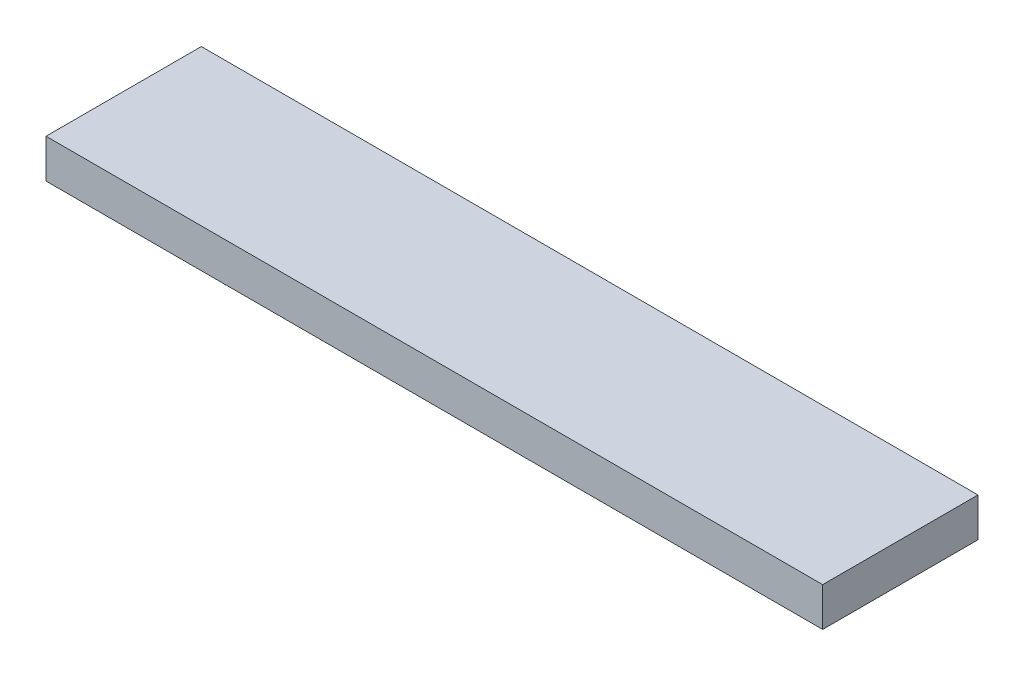
ISO-10303-21;
HEADER;
FILE_DESCRIPTION(('STEP AP214'),'2;1');
FILE_NAME('part.step','',(''),(''),'','','');
FILE_SCHEMA(('AUTOMOTIVE_DESIGN { 1 0 10303 214 1 1 1 1 }'));
ENDSEC;
DATA;
#1=APPLICATION_CONTEXT('core data for automotive mechanical design processes');
#2=APPLICATION_PROTOCOL_DEFINITION('international standard','automotive_design',2000,#1);
#3=PRODUCT_CONTEXT('',#1,'mechanical');
#4=PRODUCT('Part','Part','',(#3));
#5=PRODUCT_RELATED_PRODUCT_CATEGORY('part','',(#4));
#6=PRODUCT_DEFINITION_FORMATION('','',#4);
#7=PRODUCT_DEFINITION_CONTEXT('part definition',#1,'design');
#8=PRODUCT_DEFINITION('design','',#6,#7);
#9=PRODUCT_DEFINITION_SHAPE('','',#8);
#10=(LENGTH_UNIT() NAMED_UNIT(*) SI_UNIT(.MILLI.,.METRE.));
#11=(NAMED_UNIT(*) PLANE_ANGLE_UNIT() SI_UNIT($,.RADIAN.));
#12=(NAMED_UNIT(*) SI_UNIT($,.STERADIAN.) SOLID_ANGLE_UNIT());
#13=UNCERTAINTY_MEASURE_WITH_UNIT(LENGTH_MEASURE(1.E-05),#10,'distance_accuracy_value','');
#14=(GEOMETRIC_REPRESENTATION_CONTEXT(3) GLOBAL_UNCERTAINTY_ASSIGNED_CONTEXT((#13)) GLOBAL_UNIT_ASSIGNED_CONTEXT((#10,
#11,#12)) REPRESENTATION_CONTEXT('',''));
#15=CARTESIAN_POINT('',(0.,0.,0.));
#16=DIRECTION('',(0.,0.,1.));
#17=DIRECTION('',(1.,0.,0.));
#18=AXIS2_PLACEMENT_3D('',#15,#16,#17);
#19=CARTESIAN_POINT('',(-88.1811320754717,6.35,12.7));
#20=DIRECTION('',(1.,0.,0.));
#21=DIRECTION('',(0.,0.,-1.));
#22=AXIS2_PLACEMENT_3D('',#19,#20,#21);
#23=PLANE('',#22);
#24=DIRECTION('',(0.,0.,1.));
#25=VECTOR('',#24,1.);
#26=CARTESIAN_POINT('',(-88.1811320754717,0.,12.7));
#27=LINE('',#26,#25);
#28=CARTESIAN_POINT('',(-88.1811320754717,0.,-12.7));
#29=VERTEX_POINT('',#28);
#30=CARTESIAN_POINT('',(-88.1811320754717,0.,12.7));
#31=VERTEX_POINT('',#30);
#32=EDGE_CURVE('E107',#29,#31,#27,.T.);
#33=ORIENTED_EDGE('',*,*,#32,.T.);
#34=DIRECTION('',(0.,-1.,0.));
#35=VECTOR('',#34,1.);
#36=CARTESIAN_POINT('',(-88.1811320754717,6.35,12.7));
#37=LINE('',#36,#35);
#38=CARTESIAN_POINT('',(-88.1811320754717,6.35,12.7));
#39=VERTEX_POINT('',#38);
#40=EDGE_CURVE('E11',#39,#31,#37,.T.);
#41=ORIENTED_EDGE('',*,*,#40,.F.);
#42=DIRECTION('',(0.,0.,1.));
#43=VECTOR('',#42,1.);
#44=CARTESIAN_POINT('',(-88.1811320754717,6.35,12.7));
#45=LINE('',#44,#43);
#46=CARTESIAN_POINT('',(-88.1811320754717,6.35,-12.7));
#47=VERTEX_POINT('',#46);
#48=EDGE_CURVE('E91',#47,#39,#45,.T.);
#49=ORIENTED_EDGE('',*,*,#48,.F.);
#50=DIRECTION('',(0.,-1.,0.));
#51=VECTOR('',#50,1.);
#52=CARTESIAN_POINT('',(-88.1811320754717,6.35,-12.7));
#53=LINE('',#52,#51);
#54=EDGE_CURVE('E103',#47,#29,#53,.T.);
#55=ORIENTED_EDGE('',*,*,#54,.T.);
#56=EDGE_LOOP('',(#33,#41,#49,#55));
#57=FACE_BOUND('',#56,.T.);
#58=ADVANCED_FACE('F39',(#57),#23,.F.);
#59=CARTESIAN_POINT('',(-88.1811320754717,6.35,12.7));
#60=DIRECTION('',(0.,0.,-1.));
#61=DIRECTION('',(-1.,0.,0.));
#62=AXIS2_PLACEMENT_3D('',#59,#60,#61);
#63=PLANE('',#62);
#64=DIRECTION('',(1.,0.,0.));
#65=VECTOR('',#64,1.);
#66=CARTESIAN_POINT('',(-88.1811320754717,0.,12.7));
#67=LINE('',#66,#65);
#68=CARTESIAN_POINT('',(38.8188679245283,0.,12.7));
#69=VERTEX_POINT('',#68);
#70=EDGE_CURVE('E96',#31,#69,#67,.T.);
#71=ORIENTED_EDGE('',*,*,#70,.T.);
#72=DIRECTION('',(0.,-1.,0.));
#73=VECTOR('',#72,1.);
#74=CARTESIAN_POINT('',(38.8188679245283,6.35,12.7));
#75=LINE('',#74,#73);
#76=CARTESIAN_POINT('',(38.8188679245283,6.35,12.7));
#77=VERTEX_POINT('',#76);
#78=EDGE_CURVE('E48',#77,#69,#75,.T.);
#79=ORIENTED_EDGE('',*,*,#78,.F.);
#80=DIRECTION('',(1.,0.,0.));
#81=VECTOR('',#80,1.);
#82=CARTESIAN_POINT('',(-88.1811320754717,6.35,12.7));
#83=LINE('',#82,#81);
#84=EDGE_CURVE('E86',#39,#77,#83,.T.);
#85=ORIENTED_EDGE('',*,*,#84,.F.);
#86=ORIENTED_EDGE('',*,*,#40,.T.);
#87=EDGE_LOOP('',(#71,#79,#85,#86));
#88=FACE_BOUND('',#87,.T.);
#89=ADVANCED_FACE('F95',(#88),#63,.F.);
#90=CARTESIAN_POINT('',(38.8188679245283,6.35,12.7));
#91=DIRECTION('',(-1.,0.,0.));
#92=DIRECTION('',(0.,0.,1.));
#93=AXIS2_PLACEMENT_3D('',#90,#91,#92);
#94=PLANE('',#93);
#95=DIRECTION('',(0.,0.,-1.));
#96=VECTOR('',#95,1.);
#97=CARTESIAN_POINT('',(38.8188679245283,0.,12.7));
#98=LINE('',#97,#96);
#99=CARTESIAN_POINT('',(38.8188679245283,0.,-12.7));
#100=VERTEX_POINT('',#99);
#101=EDGE_CURVE('E73',#69,#100,#98,.T.);
#102=ORIENTED_EDGE('',*,*,#101,.T.);
#103=DIRECTION('',(0.,-1.,0.));
#104=VECTOR('',#103,1.);
#105=CARTESIAN_POINT('',(38.8188679245283,6.35,-12.7));
#106=LINE('',#105,#104);
#107=CARTESIAN_POINT('',(38.8188679245283,6.35,-12.7));
#108=VERTEX_POINT('',#107);
#109=EDGE_CURVE('E98',#108,#100,#106,.T.);
#110=ORIENTED_EDGE('',*,*,#109,.F.);
#111=DIRECTION('',(0.,0.,-1.));
#112=VECTOR('',#111,1.);
#113=CARTESIAN_POINT('',(38.8188679245283,6.35,12.7));
#114=LINE('',#113,#112);
#115=EDGE_CURVE('E89',#77,#108,#114,.T.);
#116=ORIENTED_EDGE('',*,*,#115,.F.);
#117=ORIENTED_EDGE('',*,*,#78,.T.);
#118=EDGE_LOOP('',(#102,#110,#116,#117));
#119=FACE_BOUND('',#118,.T.);
#120=ADVANCED_FACE('F99',(#119),#94,.F.);
#121=CARTESIAN_POINT('',(-88.1811320754717,6.35,-12.7));
#122=DIRECTION('',(0.,0.,1.));
#123=DIRECTION('',(1.,0.,0.));
#124=AXIS2_PLACEMENT_3D('',#121,#122,#123);
#125=PLANE('',#124);
#126=DIRECTION('',(-1.,0.,0.));
#127=VECTOR('',#126,1.);
#128=CARTESIAN_POINT('',(-88.1811320754717,0.,-12.7));
#129=LINE('',#128,#127);
#130=EDGE_CURVE('E79',#100,#29,#129,.T.);
#131=ORIENTED_EDGE('',*,*,#130,.T.);
#132=ORIENTED_EDGE('',*,*,#54,.F.);
#133=DIRECTION('',(-1.,0.,0.));
#134=VECTOR('',#133,1.);
#135=CARTESIAN_POINT('',(-88.1811320754717,6.35,-12.7));
#136=LINE('',#135,#134);
#137=EDGE_CURVE('E56',#108,#47,#136,.T.);
#138=ORIENTED_EDGE('',*,*,#137,.F.);
#139=ORIENTED_EDGE('',*,*,#109,.T.);
#140=EDGE_LOOP('',(#131,#132,#138,#139));
#141=FACE_BOUND('',#140,.T.);
#142=ADVANCED_FACE('F120',(#141),#125,.F.);
#143=CARTESIAN_POINT('',(0.,6.35,0.));
#144=DIRECTION('',(0.,-1.,0.));
#145=DIRECTION('',(0.,0.,-1.));
#146=AXIS2_PLACEMENT_3D('',#143,#144,#145);
#147=PLANE('',#146);
#148=ORIENTED_EDGE('',*,*,#48,.T.);
#149=ORIENTED_EDGE('',*,*,#84,.T.);
#150=ORIENTED_EDGE('',*,*,#115,.T.);
#151=ORIENTED_EDGE('',*,*,#137,.T.);
#152=EDGE_LOOP('',(#148,#149,#150,#151));
#153=FACE_BOUND('',#152,.T.);
#154=ADVANCED_FACE('F87',(#153),#147,.F.);
#155=CARTESIAN_POINT('',(0.,0.,0.));
#156=DIRECTION('',(0.,-1.,0.));
#157=DIRECTION('',(0.,0.,-1.));
#158=AXIS2_PLACEMENT_3D('',#155,#156,#157);
#159=PLANE('',#158);
#160=ORIENTED_EDGE('',*,*,#32,.F.);
#161=ORIENTED_EDGE('',*,*,#130,.F.);
#162=ORIENTED_EDGE('',*,*,#101,.F.);
#163=ORIENTED_EDGE('',*,*,#70,.F.);
#164=EDGE_LOOP('',(#160,#161,#162,#163));
#165=FACE_BOUND('',#164,.T.);
#166=ADVANCED_FACE('F123',(#165),#159,.T.);
#167=CLOSED_SHELL('',(#58,#89,#120,#142,#154,#166));
#168=MANIFOLD_SOLID_BREP('B2',#167);
#169=ADVANCED_BREP_SHAPE_REPRESENTATION('',(#18,#168),#14);
#170=SHAPE_DEFINITION_REPRESENTATION(#9,#169);
ENDSEC;
END-ISO-10303-21;
